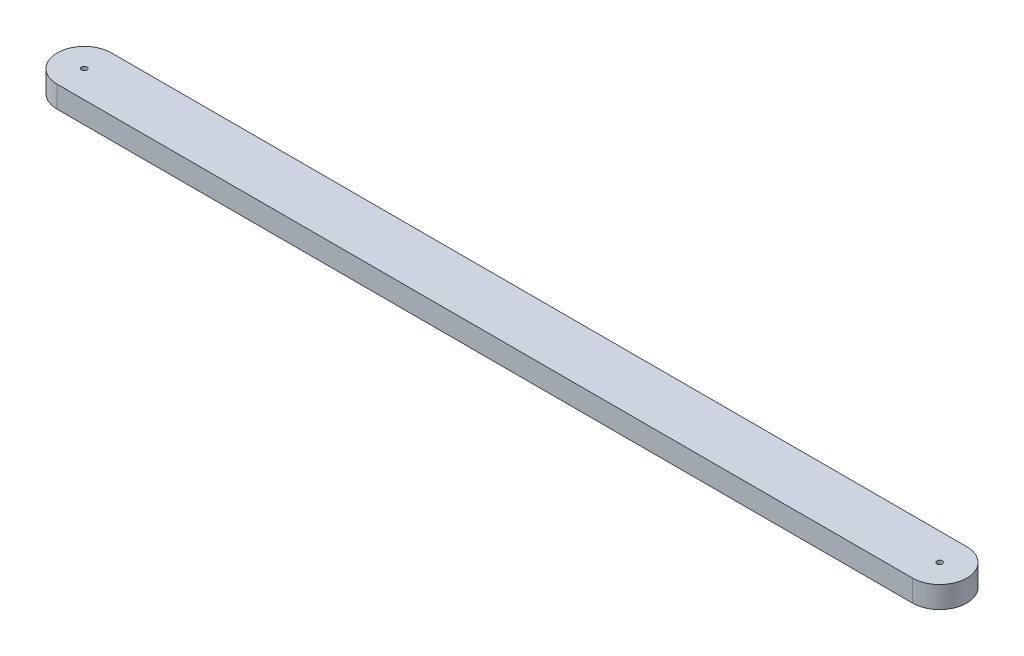
ISO-10303-21;
HEADER;
FILE_DESCRIPTION(('STEP AP214'),'2;1');
FILE_NAME('part.step','',(''),(''),'','','');
FILE_SCHEMA(('AUTOMOTIVE_DESIGN { 1 0 10303 214 1 1 1 1 }'));
ENDSEC;
DATA;
#1=APPLICATION_CONTEXT('core data for automotive mechanical design processes');
#2=APPLICATION_PROTOCOL_DEFINITION('international standard','automotive_design',2000,#1);
#3=PRODUCT_CONTEXT('',#1,'mechanical');
#4=PRODUCT('Part','Part','',(#3));
#5=PRODUCT_RELATED_PRODUCT_CATEGORY('part','',(#4));
#6=PRODUCT_DEFINITION_FORMATION('','',#4);
#7=PRODUCT_DEFINITION_CONTEXT('part definition',#1,'design');
#8=PRODUCT_DEFINITION('design','',#6,#7);
#9=PRODUCT_DEFINITION_SHAPE('','',#8);
#10=(LENGTH_UNIT() NAMED_UNIT(*) SI_UNIT(.MILLI.,.METRE.));
#11=(NAMED_UNIT(*) PLANE_ANGLE_UNIT() SI_UNIT($,.RADIAN.));
#12=(NAMED_UNIT(*) SI_UNIT($,.STERADIAN.) SOLID_ANGLE_UNIT());
#13=UNCERTAINTY_MEASURE_WITH_UNIT(LENGTH_MEASURE(1.E-05),#10,'distance_accuracy_value','');
#14=(GEOMETRIC_REPRESENTATION_CONTEXT(3) GLOBAL_UNCERTAINTY_ASSIGNED_CONTEXT((#13)) GLOBAL_UNIT_ASSIGNED_CONTEXT((#10,
#11,#12)) REPRESENTATION_CONTEXT('',''));
#15=CARTESIAN_POINT('',(0.,0.,0.));
#16=DIRECTION('',(0.,0.,1.));
#17=DIRECTION('',(1.,0.,0.));
#18=AXIS2_PLACEMENT_3D('',#15,#16,#17);
#19=CARTESIAN_POINT('',(78.805,-2.,0.));
#20=DIRECTION('',(0.,1.,0.));
#21=DIRECTION('',(0.,0.,1.));
#22=AXIS2_PLACEMENT_3D('',#19,#20,#21);
#23=CYLINDRICAL_SURFACE('',#22,5.);
#24=DIRECTION('',(0.,1.,0.));
#25=VECTOR('',#24,1.);
#26=CARTESIAN_POINT('',(78.805,-2.,-5.));
#27=LINE('',#26,#25);
#28=CARTESIAN_POINT('',(78.805,-2.,-5.));
#29=VERTEX_POINT('',#28);
#30=CARTESIAN_POINT('',(78.805,2.,-5.));
#31=VERTEX_POINT('',#30);
#32=EDGE_CURVE('E37',#29,#31,#27,.T.);
#33=ORIENTED_EDGE('',*,*,#32,.T.);
#34=CARTESIAN_POINT('',(78.805,2.,0.));
#35=DIRECTION('',(0.,1.,0.));
#36=DIRECTION('',(0.,0.,1.));
#37=AXIS2_PLACEMENT_3D('',#34,#35,#36);
#38=CIRCLE('',#37,5.);
#39=CARTESIAN_POINT('',(78.805,2.,4.99999999999999));
#40=VERTEX_POINT('',#39);
#41=EDGE_CURVE('E77',#31,#40,#38,.F.);
#42=ORIENTED_EDGE('',*,*,#41,.T.);
#43=DIRECTION('',(0.,1.,0.));
#44=VECTOR('',#43,1.);
#45=CARTESIAN_POINT('',(78.805,-2.,4.99999999999999));
#46=LINE('',#45,#44);
#47=CARTESIAN_POINT('',(78.805,-2.,4.99999999999999));
#48=VERTEX_POINT('',#47);
#49=EDGE_CURVE('E11',#48,#40,#46,.T.);
#50=ORIENTED_EDGE('',*,*,#49,.F.);
#51=CARTESIAN_POINT('',(78.805,-2.,0.));
#52=DIRECTION('',(0.,1.,0.));
#53=DIRECTION('',(0.,0.,1.));
#54=AXIS2_PLACEMENT_3D('',#51,#52,#53);
#55=CIRCLE('',#54,5.);
#56=EDGE_CURVE('E50',#29,#48,#55,.F.);
#57=ORIENTED_EDGE('',*,*,#56,.F.);
#58=EDGE_LOOP('',(#33,#42,#50,#57));
#59=FACE_BOUND('',#58,.T.);
#60=ADVANCED_FACE('F34',(#59),#23,.T.);
#61=CARTESIAN_POINT('',(0.,-2.,5.));
#62=DIRECTION('',(0.,0.,1.));
#63=DIRECTION('',(1.,0.,0.));
#64=AXIS2_PLACEMENT_3D('',#61,#62,#63);
#65=PLANE('',#64);
#66=ORIENTED_EDGE('',*,*,#49,.T.);
#67=DIRECTION('',(1.,0.,0.));
#68=VECTOR('',#67,1.);
#69=CARTESIAN_POINT('',(0.,2.,5.));
#70=LINE('',#69,#68);
#71=CARTESIAN_POINT('',(-78.805,2.,5.00000000000001));
#72=VERTEX_POINT('',#71);
#73=EDGE_CURVE('E90',#72,#40,#70,.T.);
#74=ORIENTED_EDGE('',*,*,#73,.F.);
#75=DIRECTION('',(0.,1.,0.));
#76=VECTOR('',#75,1.);
#77=CARTESIAN_POINT('',(-78.805,-2.,5.00000000000001));
#78=LINE('',#77,#76);
#79=CARTESIAN_POINT('',(-78.805,-2.,5.00000000000001));
#80=VERTEX_POINT('',#79);
#81=EDGE_CURVE('E42',#80,#72,#78,.T.);
#82=ORIENTED_EDGE('',*,*,#81,.F.);
#83=DIRECTION('',(1.,0.,0.));
#84=VECTOR('',#83,1.);
#85=CARTESIAN_POINT('',(0.,-2.,5.));
#86=LINE('',#85,#84);
#87=EDGE_CURVE('E110',#80,#48,#86,.T.);
#88=ORIENTED_EDGE('',*,*,#87,.T.);
#89=EDGE_LOOP('',(#66,#74,#82,#88));
#90=FACE_BOUND('',#89,.T.);
#91=ADVANCED_FACE('F120',(#90),#65,.T.);
#92=CARTESIAN_POINT('',(-78.805,-2.,0.));
#93=DIRECTION('',(0.,1.,0.));
#94=DIRECTION('',(0.,0.,1.));
#95=AXIS2_PLACEMENT_3D('',#92,#93,#94);
#96=CYLINDRICAL_SURFACE('',#95,5.);
#97=ORIENTED_EDGE('',*,*,#81,.T.);
#98=CARTESIAN_POINT('',(-78.805,2.,0.));
#99=DIRECTION('',(0.,1.,0.));
#100=DIRECTION('',(0.,0.,1.));
#101=AXIS2_PLACEMENT_3D('',#98,#99,#100);
#102=CIRCLE('',#101,5.);
#103=CARTESIAN_POINT('',(-78.805,2.,-4.99999999999999));
#104=VERTEX_POINT('',#103);
#105=EDGE_CURVE('E94',#104,#72,#102,.T.);
#106=ORIENTED_EDGE('',*,*,#105,.F.);
#107=DIRECTION('',(0.,1.,0.));
#108=VECTOR('',#107,1.);
#109=CARTESIAN_POINT('',(-78.805,-2.,-4.99999999999999));
#110=LINE('',#109,#108);
#111=CARTESIAN_POINT('',(-78.805,-2.,-4.99999999999999));
#112=VERTEX_POINT('',#111);
#113=EDGE_CURVE('E81',#112,#104,#110,.T.);
#114=ORIENTED_EDGE('',*,*,#113,.F.);
#115=CARTESIAN_POINT('',(-78.805,-2.,0.));
#116=DIRECTION('',(0.,1.,0.));
#117=DIRECTION('',(0.,0.,1.));
#118=AXIS2_PLACEMENT_3D('',#115,#116,#117);
#119=CIRCLE('',#118,5.);
#120=EDGE_CURVE('E108',#112,#80,#119,.T.);
#121=ORIENTED_EDGE('',*,*,#120,.T.);
#122=EDGE_LOOP('',(#97,#106,#114,#121));
#123=FACE_BOUND('',#122,.T.);
#124=ADVANCED_FACE('F118',(#123),#96,.T.);
#125=CARTESIAN_POINT('',(78.805,-2.,0.));
#126=DIRECTION('',(0.,1.,0.));
#127=DIRECTION('',(0.,0.,1.));
#128=AXIS2_PLACEMENT_3D('',#125,#126,#127);
#129=CYLINDRICAL_SURFACE('',#128,0.499999999999999);
#130=CARTESIAN_POINT('',(78.805,-2.,0.));
#131=DIRECTION('',(0.,1.,0.));
#132=DIRECTION('',(0.,0.,1.));
#133=AXIS2_PLACEMENT_3D('',#130,#131,#132);
#134=CIRCLE('',#133,0.499999999999999);
#135=CARTESIAN_POINT('',(78.805,-2.,0.499999999999994));
#136=VERTEX_POINT('',#135);
#137=EDGE_CURVE('E112',#136,#136,#134,.T.);
#138=ORIENTED_EDGE('',*,*,#137,.F.);
#139=EDGE_LOOP('',(#138));
#140=FACE_BOUND('',#139,.T.);
#141=CARTESIAN_POINT('',(78.805,2.,0.));
#142=DIRECTION('',(0.,1.,0.));
#143=DIRECTION('',(0.,0.,1.));
#144=AXIS2_PLACEMENT_3D('',#141,#142,#143);
#145=CIRCLE('',#144,0.499999999999999);
#146=CARTESIAN_POINT('',(78.805,2.,0.499999999999994));
#147=VERTEX_POINT('',#146);
#148=EDGE_CURVE('E99',#147,#147,#145,.T.);
#149=ORIENTED_EDGE('',*,*,#148,.T.);
#150=EDGE_LOOP('',(#149));
#151=FACE_BOUND('',#150,.T.);
#152=ADVANCED_FACE('F147',(#140,#151),#129,.F.);
#153=CARTESIAN_POINT('',(0.,-2.,-5.));
#154=DIRECTION('',(0.,0.,1.));
#155=DIRECTION('',(1.,0.,0.));
#156=AXIS2_PLACEMENT_3D('',#153,#154,#155);
#157=PLANE('',#156);
#158=ORIENTED_EDGE('',*,*,#113,.T.);
#159=DIRECTION('',(1.,0.,0.));
#160=VECTOR('',#159,1.);
#161=CARTESIAN_POINT('',(0.,2.,-5.));
#162=LINE('',#161,#160);
#163=EDGE_CURVE('E89',#104,#31,#162,.T.);
#164=ORIENTED_EDGE('',*,*,#163,.T.);
#165=ORIENTED_EDGE('',*,*,#32,.F.);
#166=DIRECTION('',(1.,0.,0.));
#167=VECTOR('',#166,1.);
#168=CARTESIAN_POINT('',(0.,-2.,-5.));
#169=LINE('',#168,#167);
#170=EDGE_CURVE('E106',#112,#29,#169,.T.);
#171=ORIENTED_EDGE('',*,*,#170,.F.);
#172=EDGE_LOOP('',(#158,#164,#165,#171));
#173=FACE_BOUND('',#172,.T.);
#174=ADVANCED_FACE('F92',(#173),#157,.F.);
#175=CARTESIAN_POINT('',(-78.805,-2.,0.));
#176=DIRECTION('',(0.,1.,0.));
#177=DIRECTION('',(0.,0.,1.));
#178=AXIS2_PLACEMENT_3D('',#175,#176,#177);
#179=CYLINDRICAL_SURFACE('',#178,0.499999999999999);
#180=CARTESIAN_POINT('',(-78.805,-2.,0.));
#181=DIRECTION('',(0.,1.,0.));
#182=DIRECTION('',(0.,0.,1.));
#183=AXIS2_PLACEMENT_3D('',#180,#181,#182);
#184=CIRCLE('',#183,0.499999999999999);
#185=CARTESIAN_POINT('',(-78.805,-2.,0.500000000000004));
#186=VERTEX_POINT('',#185);
#187=EDGE_CURVE('E82',#186,#186,#184,.T.);
#188=ORIENTED_EDGE('',*,*,#187,.F.);
#189=EDGE_LOOP('',(#188));
#190=FACE_BOUND('',#189,.T.);
#191=CARTESIAN_POINT('',(-78.805,2.,0.));
#192=DIRECTION('',(0.,1.,0.));
#193=DIRECTION('',(0.,0.,1.));
#194=AXIS2_PLACEMENT_3D('',#191,#192,#193);
#195=CIRCLE('',#194,0.499999999999999);
#196=CARTESIAN_POINT('',(-78.805,2.,0.500000000000004));
#197=VERTEX_POINT('',#196);
#198=EDGE_CURVE('E102',#197,#197,#195,.T.);
#199=ORIENTED_EDGE('',*,*,#198,.T.);
#200=EDGE_LOOP('',(#199));
#201=FACE_BOUND('',#200,.T.);
#202=ADVANCED_FACE('F124',(#190,#201),#179,.F.);
#203=CARTESIAN_POINT('',(0.,-2.,0.));
#204=DIRECTION('',(0.,1.,0.));
#205=DIRECTION('',(0.,0.,1.));
#206=AXIS2_PLACEMENT_3D('',#203,#204,#205);
#207=PLANE('',#206);
#208=ORIENTED_EDGE('',*,*,#56,.T.);
#209=ORIENTED_EDGE('',*,*,#87,.F.);
#210=ORIENTED_EDGE('',*,*,#120,.F.);
#211=ORIENTED_EDGE('',*,*,#170,.T.);
#212=EDGE_LOOP('',(#208,#209,#210,#211));
#213=FACE_BOUND('',#212,.T.);
#214=ORIENTED_EDGE('',*,*,#137,.T.);
#215=EDGE_LOOP('',(#214));
#216=FACE_BOUND('',#215,.T.);
#217=ORIENTED_EDGE('',*,*,#187,.T.);
#218=EDGE_LOOP('',(#217));
#219=FACE_BOUND('',#218,.T.);
#220=ADVANCED_FACE('F121',(#213,#216,#219),#207,.F.);
#221=CARTESIAN_POINT('',(0.,2.,0.));
#222=DIRECTION('',(0.,1.,0.));
#223=DIRECTION('',(0.,0.,1.));
#224=AXIS2_PLACEMENT_3D('',#221,#222,#223);
#225=PLANE('',#224);
#226=ORIENTED_EDGE('',*,*,#41,.F.);
#227=ORIENTED_EDGE('',*,*,#163,.F.);
#228=ORIENTED_EDGE('',*,*,#105,.T.);
#229=ORIENTED_EDGE('',*,*,#73,.T.);
#230=EDGE_LOOP('',(#226,#227,#228,#229));
#231=FACE_BOUND('',#230,.T.);
#232=ORIENTED_EDGE('',*,*,#148,.F.);
#233=EDGE_LOOP('',(#232));
#234=FACE_BOUND('',#233,.T.);
#235=ORIENTED_EDGE('',*,*,#198,.F.);
#236=EDGE_LOOP('',(#235));
#237=FACE_BOUND('',#236,.T.);
#238=ADVANCED_FACE('F86',(#231,#234,#237),#225,.T.);
#239=CLOSED_SHELL('',(#60,#91,#124,#152,#174,#202,#220,#238));
#240=MANIFOLD_SOLID_BREP('B2',#239);
#241=ADVANCED_BREP_SHAPE_REPRESENTATION('',(#18,#240),#14);
#242=SHAPE_DEFINITION_REPRESENTATION(#9,#241);
ENDSEC;
END-ISO-10303-21;
